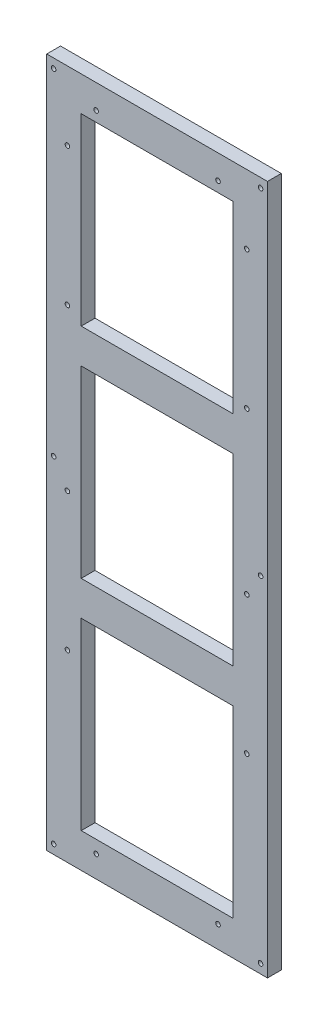
ISO-10303-21;
HEADER;
FILE_DESCRIPTION(('STEP AP214'),'2;1');
FILE_NAME('part.step','',(''),(''),'','','');
FILE_SCHEMA(('AUTOMOTIVE_DESIGN { 1 0 10303 214 1 1 1 1 }'));
ENDSEC;
DATA;
#1=APPLICATION_CONTEXT('core data for automotive mechanical design processes');
#2=APPLICATION_PROTOCOL_DEFINITION('international standard','automotive_design',2000,#1);
#3=PRODUCT_CONTEXT('',#1,'mechanical');
#4=PRODUCT('Part','Part','',(#3));
#5=PRODUCT_RELATED_PRODUCT_CATEGORY('part','',(#4));
#6=PRODUCT_DEFINITION_FORMATION('','',#4);
#7=PRODUCT_DEFINITION_CONTEXT('part definition',#1,'design');
#8=PRODUCT_DEFINITION('design','',#6,#7);
#9=PRODUCT_DEFINITION_SHAPE('','',#8);
#10=(LENGTH_UNIT() NAMED_UNIT(*) SI_UNIT(.MILLI.,.METRE.));
#11=(NAMED_UNIT(*) PLANE_ANGLE_UNIT() SI_UNIT($,.RADIAN.));
#12=(NAMED_UNIT(*) SI_UNIT($,.STERADIAN.) SOLID_ANGLE_UNIT());
#13=UNCERTAINTY_MEASURE_WITH_UNIT(LENGTH_MEASURE(1.E-05),#10,'distance_accuracy_value','');
#14=(GEOMETRIC_REPRESENTATION_CONTEXT(3) GLOBAL_UNCERTAINTY_ASSIGNED_CONTEXT((#13)) GLOBAL_UNIT_ASSIGNED_CONTEXT((#10,
#11,#12)) REPRESENTATION_CONTEXT('',''));
#15=CARTESIAN_POINT('',(0.,0.,0.));
#16=DIRECTION('',(0.,0.,1.));
#17=DIRECTION('',(1.,0.,0.));
#18=AXIS2_PLACEMENT_3D('',#15,#16,#17);
#19=CARTESIAN_POINT('',(0.,0.,6.));
#20=DIRECTION('',(0.,0.,-1.));
#21=DIRECTION('',(-1.,0.,0.));
#22=AXIS2_PLACEMENT_3D('',#19,#20,#21);
#23=PLANE('',#22);
#24=CARTESIAN_POINT('',(45.,6.00000000000001,6.));
#25=DIRECTION('',(0.,0.,1.));
#26=DIRECTION('',(1.,0.,0.));
#27=AXIS2_PLACEMENT_3D('',#24,#25,#26);
#28=CIRCLE('',#27,0.999999999999998);
#29=CARTESIAN_POINT('',(46.,6.00000000000001,6.));
#30=VERTEX_POINT('',#29);
#31=EDGE_CURVE('E724',#30,#30,#28,.T.);
#32=ORIENTED_EDGE('',*,*,#31,.F.);
#33=EDGE_LOOP('',(#32));
#34=FACE_BOUND('',#33,.T.);
#35=CARTESIAN_POINT('',(-45.,152.,6.));
#36=DIRECTION('',(0.,0.,1.));
#37=DIRECTION('',(1.,0.,0.));
#38=AXIS2_PLACEMENT_3D('',#35,#36,#37);
#39=CIRCLE('',#38,0.999999999999998);
#40=CARTESIAN_POINT('',(-44.,152.,6.));
#41=VERTEX_POINT('',#40);
#42=EDGE_CURVE('E727',#41,#41,#39,.T.);
#43=ORIENTED_EDGE('',*,*,#42,.F.);
#44=EDGE_LOOP('',(#43));
#45=FACE_BOUND('',#44,.T.);
#46=CARTESIAN_POINT('',(45.,152.,6.));
#47=DIRECTION('',(0.,0.,1.));
#48=DIRECTION('',(1.,0.,0.));
#49=AXIS2_PLACEMENT_3D('',#46,#47,#48);
#50=CIRCLE('',#49,0.999999999999998);
#51=CARTESIAN_POINT('',(46.,152.,6.));
#52=VERTEX_POINT('',#51);
#53=EDGE_CURVE('E731',#52,#52,#50,.T.);
#54=ORIENTED_EDGE('',*,*,#53,.F.);
#55=EDGE_LOOP('',(#54));
#56=FACE_BOUND('',#55,.T.);
#57=CARTESIAN_POINT('',(-45.,-140.,6.));
#58=DIRECTION('',(0.,0.,1.));
#59=DIRECTION('',(1.,0.,0.));
#60=AXIS2_PLACEMENT_3D('',#57,#58,#59);
#61=CIRCLE('',#60,0.999999999999998);
#62=CARTESIAN_POINT('',(-44.,-140.,6.));
#63=VERTEX_POINT('',#62);
#64=EDGE_CURVE('E733',#63,#63,#61,.T.);
#65=ORIENTED_EDGE('',*,*,#64,.F.);
#66=EDGE_LOOP('',(#65));
#67=FACE_BOUND('',#66,.T.);
#68=CARTESIAN_POINT('',(-45.,6.00000000000001,6.));
#69=DIRECTION('',(0.,0.,1.));
#70=DIRECTION('',(1.,0.,0.));
#71=AXIS2_PLACEMENT_3D('',#68,#69,#70);
#72=CIRCLE('',#71,0.999999999999998);
#73=CARTESIAN_POINT('',(-44.,6.00000000000001,6.));
#74=VERTEX_POINT('',#73);
#75=EDGE_CURVE('E722',#74,#74,#72,.T.);
#76=ORIENTED_EDGE('',*,*,#75,.F.);
#77=EDGE_LOOP('',(#76));
#78=FACE_BOUND('',#77,.T.);
#79=CARTESIAN_POINT('',(45.,-140.,6.));
#80=DIRECTION('',(0.,0.,1.));
#81=DIRECTION('',(1.,0.,0.));
#82=AXIS2_PLACEMENT_3D('',#79,#80,#81);
#83=CIRCLE('',#82,0.999999999999998);
#84=CARTESIAN_POINT('',(46.,-140.,6.));
#85=VERTEX_POINT('',#84);
#86=EDGE_CURVE('E319',#85,#85,#83,.T.);
#87=ORIENTED_EDGE('',*,*,#86,.F.);
#88=EDGE_LOOP('',(#87));
#89=FACE_BOUND('',#88,.T.);
#90=CARTESIAN_POINT('',(26.5,-134.5,6.));
#91=DIRECTION('',(0.,0.,1.));
#92=DIRECTION('',(1.,0.,0.));
#93=AXIS2_PLACEMENT_3D('',#90,#91,#92);
#94=CIRCLE('',#93,1.);
#95=CARTESIAN_POINT('',(27.5,-134.5,6.));
#96=VERTEX_POINT('',#95);
#97=EDGE_CURVE('E341',#96,#96,#94,.T.);
#98=ORIENTED_EDGE('',*,*,#97,.F.);
#99=EDGE_LOOP('',(#98));
#100=FACE_BOUND('',#99,.T.);
#101=CARTESIAN_POINT('',(-26.5,145.5,6.));
#102=DIRECTION('',(0.,0.,1.));
#103=DIRECTION('',(1.,0.,0.));
#104=AXIS2_PLACEMENT_3D('',#101,#102,#103);
#105=CIRCLE('',#104,1.);
#106=CARTESIAN_POINT('',(-25.5,145.5,6.));
#107=VERTEX_POINT('',#106);
#108=EDGE_CURVE('E336',#107,#107,#105,.T.);
#109=ORIENTED_EDGE('',*,*,#108,.F.);
#110=EDGE_LOOP('',(#109));
#111=FACE_BOUND('',#110,.T.);
#112=CARTESIAN_POINT('',(26.5,145.5,6.));
#113=DIRECTION('',(0.,0.,1.));
#114=DIRECTION('',(1.,0.,0.));
#115=AXIS2_PLACEMENT_3D('',#112,#113,#114);
#116=CIRCLE('',#115,1.);
#117=CARTESIAN_POINT('',(27.5,145.5,6.));
#118=VERTEX_POINT('',#117);
#119=EDGE_CURVE('E332',#118,#118,#116,.T.);
#120=ORIENTED_EDGE('',*,*,#119,.F.);
#121=EDGE_LOOP('',(#120));
#122=FACE_BOUND('',#121,.T.);
#123=CARTESIAN_POINT('',(-26.5,-134.5,6.));
#124=DIRECTION('',(0.,0.,1.));
#125=DIRECTION('',(1.,0.,0.));
#126=AXIS2_PLACEMENT_3D('',#123,#124,#125);
#127=CIRCLE('',#126,1.);
#128=CARTESIAN_POINT('',(-25.5,-134.5,6.));
#129=VERTEX_POINT('',#128);
#130=EDGE_CURVE('E305',#129,#129,#127,.T.);
#131=ORIENTED_EDGE('',*,*,#130,.F.);
#132=EDGE_LOOP('',(#131));
#133=FACE_BOUND('',#132,.T.);
#134=CARTESIAN_POINT('',(39.,66.,6.));
#135=DIRECTION('',(0.,0.,1.));
#136=DIRECTION('',(-1.,0.,0.));
#137=AXIS2_PLACEMENT_3D('',#134,#135,#136);
#138=CIRCLE('',#137,0.999999999999998);
#139=CARTESIAN_POINT('',(38.,66.,6.));
#140=VERTEX_POINT('',#139);
#141=EDGE_CURVE('E356',#140,#140,#138,.T.);
#142=ORIENTED_EDGE('',*,*,#141,.F.);
#143=EDGE_LOOP('',(#142));
#144=FACE_BOUND('',#143,.T.);
#145=CARTESIAN_POINT('',(-39.,-3.99999999999998,6.));
#146=DIRECTION('',(0.,0.,1.));
#147=DIRECTION('',(1.,0.,0.));
#148=AXIS2_PLACEMENT_3D('',#145,#146,#147);
#149=CIRCLE('',#148,0.999999999999998);
#150=CARTESIAN_POINT('',(-38.,-3.99999999999998,6.));
#151=VERTEX_POINT('',#150);
#152=EDGE_CURVE('E359',#151,#151,#149,.T.);
#153=ORIENTED_EDGE('',*,*,#152,.F.);
#154=EDGE_LOOP('',(#153));
#155=FACE_BOUND('',#154,.T.);
#156=CARTESIAN_POINT('',(39.,-3.99999999999998,6.));
#157=DIRECTION('',(0.,0.,1.));
#158=DIRECTION('',(-1.,0.,0.));
#159=AXIS2_PLACEMENT_3D('',#156,#157,#158);
#160=CIRCLE('',#159,0.999999999999998);
#161=CARTESIAN_POINT('',(38.,-3.99999999999998,6.));
#162=VERTEX_POINT('',#161);
#163=EDGE_CURVE('E362',#162,#162,#160,.T.);
#164=ORIENTED_EDGE('',*,*,#163,.F.);
#165=EDGE_LOOP('',(#164));
#166=FACE_BOUND('',#165,.T.);
#167=CARTESIAN_POINT('',(39.,-64.,6.));
#168=DIRECTION('',(0.,0.,1.));
#169=DIRECTION('',(-1.,0.,0.));
#170=AXIS2_PLACEMENT_3D('',#167,#168,#169);
#171=CIRCLE('',#170,0.999999999999998);
#172=CARTESIAN_POINT('',(38.,-64.,6.));
#173=VERTEX_POINT('',#172);
#174=EDGE_CURVE('E365',#173,#173,#171,.T.);
#175=ORIENTED_EDGE('',*,*,#174,.F.);
#176=EDGE_LOOP('',(#175));
#177=FACE_BOUND('',#176,.T.);
#178=CARTESIAN_POINT('',(-39.,66.,6.));
#179=DIRECTION('',(0.,0.,1.));
#180=DIRECTION('',(1.,0.,0.));
#181=AXIS2_PLACEMENT_3D('',#178,#179,#180);
#182=CIRCLE('',#181,0.999999999999998);
#183=CARTESIAN_POINT('',(-38.,66.,6.));
#184=VERTEX_POINT('',#183);
#185=EDGE_CURVE('E314',#184,#184,#182,.T.);
#186=ORIENTED_EDGE('',*,*,#185,.F.);
#187=EDGE_LOOP('',(#186));
#188=FACE_BOUND('',#187,.T.);
#189=CARTESIAN_POINT('',(-39.,-64.,6.));
#190=DIRECTION('',(0.,0.,1.));
#191=DIRECTION('',(1.,0.,0.));
#192=AXIS2_PLACEMENT_3D('',#189,#190,#191);
#193=CIRCLE('',#192,0.999999999999998);
#194=CARTESIAN_POINT('',(-38.,-64.,6.));
#195=VERTEX_POINT('',#194);
#196=EDGE_CURVE('E352',#195,#195,#193,.T.);
#197=ORIENTED_EDGE('',*,*,#196,.F.);
#198=EDGE_LOOP('',(#197));
#199=FACE_BOUND('',#198,.T.);
#200=CARTESIAN_POINT('',(39.,126.,6.));
#201=DIRECTION('',(0.,0.,1.));
#202=DIRECTION('',(-1.,0.,0.));
#203=AXIS2_PLACEMENT_3D('',#200,#201,#202);
#204=CIRCLE('',#203,0.999999999999998);
#205=CARTESIAN_POINT('',(38.,126.,6.));
#206=VERTEX_POINT('',#205);
#207=EDGE_CURVE('E353',#206,#206,#204,.T.);
#208=ORIENTED_EDGE('',*,*,#207,.F.);
#209=EDGE_LOOP('',(#208));
#210=FACE_BOUND('',#209,.T.);
#211=CARTESIAN_POINT('',(-39.,126.,6.));
#212=DIRECTION('',(0.,0.,1.));
#213=DIRECTION('',(1.,0.,0.));
#214=AXIS2_PLACEMENT_3D('',#211,#212,#213);
#215=CIRCLE('',#214,0.999999999999998);
#216=CARTESIAN_POINT('',(-38.,126.,6.));
#217=VERTEX_POINT('',#216);
#218=EDGE_CURVE('E281',#217,#217,#215,.T.);
#219=ORIENTED_EDGE('',*,*,#218,.F.);
#220=EDGE_LOOP('',(#219));
#221=FACE_BOUND('',#220,.T.);
#222=DIRECTION('',(0.,-1.,0.));
#223=VECTOR('',#222,1.);
#224=CARTESIAN_POINT('',(-33.,-49.,6.));
#225=LINE('',#224,#223);
#226=CARTESIAN_POINT('',(-33.,-49.,6.));
#227=VERTEX_POINT('',#226);
#228=CARTESIAN_POINT('',(-33.,-129.,6.));
#229=VERTEX_POINT('',#228);
#230=EDGE_CURVE('E190',#227,#229,#225,.T.);
#231=ORIENTED_EDGE('',*,*,#230,.F.);
#232=DIRECTION('',(-1.,0.,0.));
#233=VECTOR('',#232,1.);
#234=CARTESIAN_POINT('',(-33.,-49.,6.));
#235=LINE('',#234,#233);
#236=CARTESIAN_POINT('',(33.,-49.,6.));
#237=VERTEX_POINT('',#236);
#238=EDGE_CURVE('E198',#237,#227,#235,.T.);
#239=ORIENTED_EDGE('',*,*,#238,.F.);
#240=DIRECTION('',(0.,1.,0.));
#241=VECTOR('',#240,1.);
#242=CARTESIAN_POINT('',(33.,-49.,6.));
#243=LINE('',#242,#241);
#244=CARTESIAN_POINT('',(33.,-129.,6.));
#245=VERTEX_POINT('',#244);
#246=EDGE_CURVE('E195',#245,#237,#243,.T.);
#247=ORIENTED_EDGE('',*,*,#246,.F.);
#248=DIRECTION('',(1.,0.,0.));
#249=VECTOR('',#248,1.);
#250=CARTESIAN_POINT('',(-33.,-129.,6.));
#251=LINE('',#250,#249);
#252=EDGE_CURVE('E192',#229,#245,#251,.T.);
#253=ORIENTED_EDGE('',*,*,#252,.F.);
#254=EDGE_LOOP('',(#231,#239,#247,#253));
#255=FACE_BOUND('',#254,.T.);
#256=DIRECTION('',(0.,1.,0.));
#257=VECTOR('',#256,1.);
#258=CARTESIAN_POINT('',(48.,-144.,6.));
#259=LINE('',#258,#257);
#260=CARTESIAN_POINT('',(48.,-144.,6.));
#261=VERTEX_POINT('',#260);
#262=CARTESIAN_POINT('',(48.,156.,6.));
#263=VERTEX_POINT('',#262);
#264=EDGE_CURVE('E252',#261,#263,#259,.T.);
#265=ORIENTED_EDGE('',*,*,#264,.T.);
#266=DIRECTION('',(-1.,0.,0.));
#267=VECTOR('',#266,1.);
#268=CARTESIAN_POINT('',(-48.,156.,6.));
#269=LINE('',#268,#267);
#270=CARTESIAN_POINT('',(-48.,156.,6.));
#271=VERTEX_POINT('',#270);
#272=EDGE_CURVE('E255',#263,#271,#269,.T.);
#273=ORIENTED_EDGE('',*,*,#272,.T.);
#274=DIRECTION('',(0.,-1.,0.));
#275=VECTOR('',#274,1.);
#276=CARTESIAN_POINT('',(-48.,-144.,6.));
#277=LINE('',#276,#275);
#278=CARTESIAN_POINT('',(-48.,-144.,6.));
#279=VERTEX_POINT('',#278);
#280=EDGE_CURVE('E258',#271,#279,#277,.T.);
#281=ORIENTED_EDGE('',*,*,#280,.T.);
#282=DIRECTION('',(1.,0.,0.));
#283=VECTOR('',#282,1.);
#284=CARTESIAN_POINT('',(-48.,-144.,6.));
#285=LINE('',#284,#283);
#286=EDGE_CURVE('E260',#279,#261,#285,.T.);
#287=ORIENTED_EDGE('',*,*,#286,.T.);
#288=EDGE_LOOP('',(#265,#273,#281,#287));
#289=FACE_BOUND('',#288,.T.);
#290=DIRECTION('',(-1.,0.,0.));
#291=VECTOR('',#290,1.);
#292=CARTESIAN_POINT('',(-33.,141.,6.));
#293=LINE('',#292,#291);
#294=CARTESIAN_POINT('',(33.,141.,6.));
#295=VERTEX_POINT('',#294);
#296=CARTESIAN_POINT('',(-33.,141.,6.));
#297=VERTEX_POINT('',#296);
#298=EDGE_CURVE('E221',#295,#297,#293,.T.);
#299=ORIENTED_EDGE('',*,*,#298,.F.);
#300=DIRECTION('',(0.,1.,0.));
#301=VECTOR('',#300,1.);
#302=CARTESIAN_POINT('',(33.,141.,6.));
#303=LINE('',#302,#301);
#304=CARTESIAN_POINT('',(33.,61.,6.));
#305=VERTEX_POINT('',#304);
#306=EDGE_CURVE('E229',#305,#295,#303,.T.);
#307=ORIENTED_EDGE('',*,*,#306,.F.);
#308=DIRECTION('',(1.,0.,0.));
#309=VECTOR('',#308,1.);
#310=CARTESIAN_POINT('',(-33.,61.,6.));
#311=LINE('',#310,#309);
#312=CARTESIAN_POINT('',(-33.,61.,6.));
#313=VERTEX_POINT('',#312);
#314=EDGE_CURVE('E226',#313,#305,#311,.T.);
#315=ORIENTED_EDGE('',*,*,#314,.F.);
#316=DIRECTION('',(0.,-1.,0.));
#317=VECTOR('',#316,1.);
#318=CARTESIAN_POINT('',(-33.,61.,6.));
#319=LINE('',#318,#317);
#320=EDGE_CURVE('E223',#297,#313,#319,.T.);
#321=ORIENTED_EDGE('',*,*,#320,.F.);
#322=EDGE_LOOP('',(#299,#307,#315,#321));
#323=FACE_BOUND('',#322,.T.);
#324=DIRECTION('',(0.,1.,0.));
#325=VECTOR('',#324,1.);
#326=CARTESIAN_POINT('',(33.,46.,6.));
#327=LINE('',#326,#325);
#328=CARTESIAN_POINT('',(33.,-34.,6.));
#329=VERTEX_POINT('',#328);
#330=CARTESIAN_POINT('',(33.,46.,6.));
#331=VERTEX_POINT('',#330);
#332=EDGE_CURVE('E152',#329,#331,#327,.T.);
#333=ORIENTED_EDGE('',*,*,#332,.F.);
#334=DIRECTION('',(1.,0.,0.));
#335=VECTOR('',#334,1.);
#336=CARTESIAN_POINT('',(-33.,-34.,6.));
#337=LINE('',#336,#335);
#338=CARTESIAN_POINT('',(-33.,-34.,6.));
#339=VERTEX_POINT('',#338);
#340=EDGE_CURVE('E174',#339,#329,#337,.T.);
#341=ORIENTED_EDGE('',*,*,#340,.F.);
#342=DIRECTION('',(0.,-1.,0.));
#343=VECTOR('',#342,1.);
#344=CARTESIAN_POINT('',(-33.,46.,6.));
#345=LINE('',#344,#343);
#346=CARTESIAN_POINT('',(-33.,46.,6.));
#347=VERTEX_POINT('',#346);
#348=EDGE_CURVE('E172',#347,#339,#345,.T.);
#349=ORIENTED_EDGE('',*,*,#348,.F.);
#350=DIRECTION('',(-1.,0.,0.));
#351=VECTOR('',#350,1.);
#352=CARTESIAN_POINT('',(-33.,46.,6.));
#353=LINE('',#352,#351);
#354=EDGE_CURVE('E160',#331,#347,#353,.T.);
#355=ORIENTED_EDGE('',*,*,#354,.F.);
#356=EDGE_LOOP('',(#333,#341,#349,#355));
#357=FACE_BOUND('',#356,.T.);
#358=ADVANCED_FACE('F37',(#34,#45,#56,#67,#78,#89,#100,#111,#122,#133,#144,#155,#166,#177,#188,
#199,#210,#221,#255,#289,#323,#357),#23,.F.);
#359=CARTESIAN_POINT('',(0.,0.,0.));
#360=DIRECTION('',(0.,0.,-1.));
#361=DIRECTION('',(-1.,0.,0.));
#362=AXIS2_PLACEMENT_3D('',#359,#360,#361);
#363=PLANE('',#362);
#364=CARTESIAN_POINT('',(45.,6.00000000000001,0.));
#365=DIRECTION('',(0.,0.,-1.));
#366=DIRECTION('',(-1.,0.,0.));
#367=AXIS2_PLACEMENT_3D('',#364,#365,#366);
#368=CIRCLE('',#367,0.999999999999998);
#369=CARTESIAN_POINT('',(44.,6.00000000000001,0.));
#370=VERTEX_POINT('',#369);
#371=EDGE_CURVE('E41',#370,#370,#368,.T.);
#372=ORIENTED_EDGE('',*,*,#371,.F.);
#373=EDGE_LOOP('',(#372));
#374=FACE_BOUND('',#373,.T.);
#375=CARTESIAN_POINT('',(-45.,152.,0.));
#376=DIRECTION('',(0.,0.,-1.));
#377=DIRECTION('',(-1.,0.,0.));
#378=AXIS2_PLACEMENT_3D('',#375,#376,#377);
#379=CIRCLE('',#378,0.999999999999998);
#380=CARTESIAN_POINT('',(-46.,152.,0.));
#381=VERTEX_POINT('',#380);
#382=EDGE_CURVE('E327',#381,#381,#379,.T.);
#383=ORIENTED_EDGE('',*,*,#382,.F.);
#384=EDGE_LOOP('',(#383));
#385=FACE_BOUND('',#384,.T.);
#386=CARTESIAN_POINT('',(45.,152.,0.));
#387=DIRECTION('',(0.,0.,-1.));
#388=DIRECTION('',(-1.,0.,0.));
#389=AXIS2_PLACEMENT_3D('',#386,#387,#388);
#390=CIRCLE('',#389,0.999999999999998);
#391=CARTESIAN_POINT('',(44.,152.,0.));
#392=VERTEX_POINT('',#391);
#393=EDGE_CURVE('E325',#392,#392,#390,.T.);
#394=ORIENTED_EDGE('',*,*,#393,.F.);
#395=EDGE_LOOP('',(#394));
#396=FACE_BOUND('',#395,.T.);
#397=CARTESIAN_POINT('',(-45.,-140.,0.));
#398=DIRECTION('',(0.,0.,-1.));
#399=DIRECTION('',(-1.,0.,0.));
#400=AXIS2_PLACEMENT_3D('',#397,#398,#399);
#401=CIRCLE('',#400,0.999999999999998);
#402=CARTESIAN_POINT('',(-46.,-140.,0.));
#403=VERTEX_POINT('',#402);
#404=EDGE_CURVE('E322',#403,#403,#401,.T.);
#405=ORIENTED_EDGE('',*,*,#404,.F.);
#406=EDGE_LOOP('',(#405));
#407=FACE_BOUND('',#406,.T.);
#408=CARTESIAN_POINT('',(-45.,6.00000000000001,0.));
#409=DIRECTION('',(0.,0.,-1.));
#410=DIRECTION('',(-1.,0.,0.));
#411=AXIS2_PLACEMENT_3D('',#408,#409,#410);
#412=CIRCLE('',#411,0.999999999999998);
#413=CARTESIAN_POINT('',(-46.,6.00000000000001,0.));
#414=VERTEX_POINT('',#413);
#415=EDGE_CURVE('E318',#414,#414,#412,.T.);
#416=ORIENTED_EDGE('',*,*,#415,.F.);
#417=EDGE_LOOP('',(#416));
#418=FACE_BOUND('',#417,.T.);
#419=CARTESIAN_POINT('',(45.,-140.,0.));
#420=DIRECTION('',(0.,0.,-1.));
#421=DIRECTION('',(-1.,0.,0.));
#422=AXIS2_PLACEMENT_3D('',#419,#420,#421);
#423=CIRCLE('',#422,0.999999999999998);
#424=CARTESIAN_POINT('',(44.,-140.,0.));
#425=VERTEX_POINT('',#424);
#426=EDGE_CURVE('E315',#425,#425,#423,.T.);
#427=ORIENTED_EDGE('',*,*,#426,.F.);
#428=EDGE_LOOP('',(#427));
#429=FACE_BOUND('',#428,.T.);
#430=CARTESIAN_POINT('',(26.5,-134.5,0.));
#431=DIRECTION('',(0.,0.,-1.));
#432=DIRECTION('',(-1.,0.,0.));
#433=AXIS2_PLACEMENT_3D('',#430,#431,#432);
#434=CIRCLE('',#433,1.);
#435=CARTESIAN_POINT('',(25.5,-134.5,0.));
#436=VERTEX_POINT('',#435);
#437=EDGE_CURVE('E311',#436,#436,#434,.T.);
#438=ORIENTED_EDGE('',*,*,#437,.F.);
#439=EDGE_LOOP('',(#438));
#440=FACE_BOUND('',#439,.T.);
#441=CARTESIAN_POINT('',(-26.5,145.5,0.));
#442=DIRECTION('',(0.,0.,-1.));
#443=DIRECTION('',(-1.,0.,0.));
#444=AXIS2_PLACEMENT_3D('',#441,#442,#443);
#445=CIRCLE('',#444,1.);
#446=CARTESIAN_POINT('',(-27.5,145.5,0.));
#447=VERTEX_POINT('',#446);
#448=EDGE_CURVE('E308',#447,#447,#445,.T.);
#449=ORIENTED_EDGE('',*,*,#448,.F.);
#450=EDGE_LOOP('',(#449));
#451=FACE_BOUND('',#450,.T.);
#452=CARTESIAN_POINT('',(26.5,145.5,0.));
#453=DIRECTION('',(0.,0.,-1.));
#454=DIRECTION('',(-1.,0.,0.));
#455=AXIS2_PLACEMENT_3D('',#452,#453,#454);
#456=CIRCLE('',#455,1.);
#457=CARTESIAN_POINT('',(25.5,145.5,0.));
#458=VERTEX_POINT('',#457);
#459=EDGE_CURVE('E304',#458,#458,#456,.T.);
#460=ORIENTED_EDGE('',*,*,#459,.F.);
#461=EDGE_LOOP('',(#460));
#462=FACE_BOUND('',#461,.T.);
#463=CARTESIAN_POINT('',(-26.5,-134.5,0.));
#464=DIRECTION('',(0.,0.,-1.));
#465=DIRECTION('',(-1.,0.,0.));
#466=AXIS2_PLACEMENT_3D('',#463,#464,#465);
#467=CIRCLE('',#466,1.);
#468=CARTESIAN_POINT('',(-27.5,-134.5,0.));
#469=VERTEX_POINT('',#468);
#470=EDGE_CURVE('E301',#469,#469,#467,.T.);
#471=ORIENTED_EDGE('',*,*,#470,.F.);
#472=EDGE_LOOP('',(#471));
#473=FACE_BOUND('',#472,.T.);
#474=CARTESIAN_POINT('',(39.,66.,0.));
#475=DIRECTION('',(0.,0.,-1.));
#476=DIRECTION('',(-1.,0.,0.));
#477=AXIS2_PLACEMENT_3D('',#474,#475,#476);
#478=CIRCLE('',#477,0.999999999999998);
#479=CARTESIAN_POINT('',(38.,66.,0.));
#480=VERTEX_POINT('',#479);
#481=EDGE_CURVE('E180',#480,#480,#478,.T.);
#482=ORIENTED_EDGE('',*,*,#481,.F.);
#483=EDGE_LOOP('',(#482));
#484=FACE_BOUND('',#483,.T.);
#485=CARTESIAN_POINT('',(-39.,-3.99999999999998,0.));
#486=DIRECTION('',(0.,0.,-1.));
#487=DIRECTION('',(-1.,0.,0.));
#488=AXIS2_PLACEMENT_3D('',#485,#486,#487);
#489=CIRCLE('',#488,0.999999999999998);
#490=CARTESIAN_POINT('',(-40.,-3.99999999999998,0.));
#491=VERTEX_POINT('',#490);
#492=EDGE_CURVE('E296',#491,#491,#489,.T.);
#493=ORIENTED_EDGE('',*,*,#492,.F.);
#494=EDGE_LOOP('',(#493));
#495=FACE_BOUND('',#494,.T.);
#496=CARTESIAN_POINT('',(39.,-3.99999999999998,0.));
#497=DIRECTION('',(0.,0.,-1.));
#498=DIRECTION('',(-1.,0.,0.));
#499=AXIS2_PLACEMENT_3D('',#496,#497,#498);
#500=CIRCLE('',#499,0.999999999999998);
#501=CARTESIAN_POINT('',(38.,-3.99999999999998,0.));
#502=VERTEX_POINT('',#501);
#503=EDGE_CURVE('E293',#502,#502,#500,.T.);
#504=ORIENTED_EDGE('',*,*,#503,.F.);
#505=EDGE_LOOP('',(#504));
#506=FACE_BOUND('',#505,.T.);
#507=CARTESIAN_POINT('',(39.,-64.,0.));
#508=DIRECTION('',(0.,0.,-1.));
#509=DIRECTION('',(-1.,0.,0.));
#510=AXIS2_PLACEMENT_3D('',#507,#508,#509);
#511=CIRCLE('',#510,0.999999999999998);
#512=CARTESIAN_POINT('',(38.,-64.,0.));
#513=VERTEX_POINT('',#512);
#514=EDGE_CURVE('E290',#513,#513,#511,.T.);
#515=ORIENTED_EDGE('',*,*,#514,.F.);
#516=EDGE_LOOP('',(#515));
#517=FACE_BOUND('',#516,.T.);
#518=CARTESIAN_POINT('',(-39.,66.,0.));
#519=DIRECTION('',(0.,0.,-1.));
#520=DIRECTION('',(-1.,0.,0.));
#521=AXIS2_PLACEMENT_3D('',#518,#519,#520);
#522=CIRCLE('',#521,0.999999999999998);
#523=CARTESIAN_POINT('',(-40.,66.,0.));
#524=VERTEX_POINT('',#523);
#525=EDGE_CURVE('E287',#524,#524,#522,.T.);
#526=ORIENTED_EDGE('',*,*,#525,.F.);
#527=EDGE_LOOP('',(#526));
#528=FACE_BOUND('',#527,.T.);
#529=CARTESIAN_POINT('',(-39.,-64.,0.));
#530=DIRECTION('',(0.,0.,-1.));
#531=DIRECTION('',(-1.,0.,0.));
#532=AXIS2_PLACEMENT_3D('',#529,#530,#531);
#533=CIRCLE('',#532,0.999999999999998);
#534=CARTESIAN_POINT('',(-40.,-64.,0.));
#535=VERTEX_POINT('',#534);
#536=EDGE_CURVE('E284',#535,#535,#533,.T.);
#537=ORIENTED_EDGE('',*,*,#536,.F.);
#538=EDGE_LOOP('',(#537));
#539=FACE_BOUND('',#538,.T.);
#540=CARTESIAN_POINT('',(39.,126.,0.));
#541=DIRECTION('',(0.,0.,-1.));
#542=DIRECTION('',(-1.,0.,0.));
#543=AXIS2_PLACEMENT_3D('',#540,#541,#542);
#544=CIRCLE('',#543,0.999999999999998);
#545=CARTESIAN_POINT('',(38.,126.,0.));
#546=VERTEX_POINT('',#545);
#547=EDGE_CURVE('E280',#546,#546,#544,.T.);
#548=ORIENTED_EDGE('',*,*,#547,.F.);
#549=EDGE_LOOP('',(#548));
#550=FACE_BOUND('',#549,.T.);
#551=CARTESIAN_POINT('',(-39.,126.,0.));
#552=DIRECTION('',(0.,0.,-1.));
#553=DIRECTION('',(-1.,0.,0.));
#554=AXIS2_PLACEMENT_3D('',#551,#552,#553);
#555=CIRCLE('',#554,0.999999999999998);
#556=CARTESIAN_POINT('',(-40.,126.,0.));
#557=VERTEX_POINT('',#556);
#558=EDGE_CURVE('E277',#557,#557,#555,.T.);
#559=ORIENTED_EDGE('',*,*,#558,.F.);
#560=EDGE_LOOP('',(#559));
#561=FACE_BOUND('',#560,.T.);
#562=DIRECTION('',(0.,1.,0.));
#563=VECTOR('',#562,1.);
#564=CARTESIAN_POINT('',(48.,-144.,0.));
#565=LINE('',#564,#563);
#566=CARTESIAN_POINT('',(48.,-144.,0.));
#567=VERTEX_POINT('',#566);
#568=CARTESIAN_POINT('',(48.,156.,0.));
#569=VERTEX_POINT('',#568);
#570=EDGE_CURVE('E251',#567,#569,#565,.T.);
#571=ORIENTED_EDGE('',*,*,#570,.F.);
#572=DIRECTION('',(1.,0.,0.));
#573=VECTOR('',#572,1.);
#574=CARTESIAN_POINT('',(-48.,-144.,0.));
#575=LINE('',#574,#573);
#576=CARTESIAN_POINT('',(-48.,-144.,0.));
#577=VERTEX_POINT('',#576);
#578=EDGE_CURVE('E256',#577,#567,#575,.T.);
#579=ORIENTED_EDGE('',*,*,#578,.F.);
#580=DIRECTION('',(0.,-1.,0.));
#581=VECTOR('',#580,1.);
#582=CARTESIAN_POINT('',(-48.,-144.,0.));
#583=LINE('',#582,#581);
#584=CARTESIAN_POINT('',(-48.,156.,0.));
#585=VERTEX_POINT('',#584);
#586=EDGE_CURVE('E267',#585,#577,#583,.T.);
#587=ORIENTED_EDGE('',*,*,#586,.F.);
#588=DIRECTION('',(-1.,0.,0.));
#589=VECTOR('',#588,1.);
#590=CARTESIAN_POINT('',(-48.,156.,0.));
#591=LINE('',#590,#589);
#592=EDGE_CURVE('E265',#569,#585,#591,.T.);
#593=ORIENTED_EDGE('',*,*,#592,.F.);
#594=EDGE_LOOP('',(#571,#579,#587,#593));
#595=FACE_BOUND('',#594,.T.);
#596=DIRECTION('',(0.,1.,0.));
#597=VECTOR('',#596,1.);
#598=CARTESIAN_POINT('',(33.,141.,0.));
#599=LINE('',#598,#597);
#600=CARTESIAN_POINT('',(33.,61.,0.));
#601=VERTEX_POINT('',#600);
#602=CARTESIAN_POINT('',(33.,141.,0.));
#603=VERTEX_POINT('',#602);
#604=EDGE_CURVE('E224',#601,#603,#599,.T.);
#605=ORIENTED_EDGE('',*,*,#604,.T.);
#606=DIRECTION('',(-1.,0.,0.));
#607=VECTOR('',#606,1.);
#608=CARTESIAN_POINT('',(-33.,141.,0.));
#609=LINE('',#608,#607);
#610=CARTESIAN_POINT('',(-33.,141.,0.));
#611=VERTEX_POINT('',#610);
#612=EDGE_CURVE('E220',#603,#611,#609,.T.);
#613=ORIENTED_EDGE('',*,*,#612,.T.);
#614=DIRECTION('',(0.,-1.,0.));
#615=VECTOR('',#614,1.);
#616=CARTESIAN_POINT('',(-33.,61.,0.));
#617=LINE('',#616,#615);
#618=CARTESIAN_POINT('',(-33.,61.,0.));
#619=VERTEX_POINT('',#618);
#620=EDGE_CURVE('E234',#611,#619,#617,.T.);
#621=ORIENTED_EDGE('',*,*,#620,.T.);
#622=DIRECTION('',(1.,0.,0.));
#623=VECTOR('',#622,1.);
#624=CARTESIAN_POINT('',(-33.,61.,0.));
#625=LINE('',#624,#623);
#626=EDGE_CURVE('E237',#619,#601,#625,.T.);
#627=ORIENTED_EDGE('',*,*,#626,.T.);
#628=EDGE_LOOP('',(#605,#613,#621,#627));
#629=FACE_BOUND('',#628,.T.);
#630=DIRECTION('',(-1.,0.,0.));
#631=VECTOR('',#630,1.);
#632=CARTESIAN_POINT('',(-33.,-49.,0.));
#633=LINE('',#632,#631);
#634=CARTESIAN_POINT('',(33.,-49.,0.));
#635=VERTEX_POINT('',#634);
#636=CARTESIAN_POINT('',(-33.,-49.,0.));
#637=VERTEX_POINT('',#636);
#638=EDGE_CURVE('E193',#635,#637,#633,.T.);
#639=ORIENTED_EDGE('',*,*,#638,.T.);
#640=DIRECTION('',(0.,-1.,0.));
#641=VECTOR('',#640,1.);
#642=CARTESIAN_POINT('',(-33.,-49.,0.));
#643=LINE('',#642,#641);
#644=CARTESIAN_POINT('',(-33.,-129.,0.));
#645=VERTEX_POINT('',#644);
#646=EDGE_CURVE('E168',#637,#645,#643,.T.);
#647=ORIENTED_EDGE('',*,*,#646,.T.);
#648=DIRECTION('',(1.,0.,0.));
#649=VECTOR('',#648,1.);
#650=CARTESIAN_POINT('',(-33.,-129.,0.));
#651=LINE('',#650,#649);
#652=CARTESIAN_POINT('',(33.,-129.,0.));
#653=VERTEX_POINT('',#652);
#654=EDGE_CURVE('E203',#645,#653,#651,.T.);
#655=ORIENTED_EDGE('',*,*,#654,.T.);
#656=DIRECTION('',(0.,1.,0.));
#657=VECTOR('',#656,1.);
#658=CARTESIAN_POINT('',(33.,-49.,0.));
#659=LINE('',#658,#657);
#660=EDGE_CURVE('E206',#653,#635,#659,.T.);
#661=ORIENTED_EDGE('',*,*,#660,.T.);
#662=EDGE_LOOP('',(#639,#647,#655,#661));
#663=FACE_BOUND('',#662,.T.);
#664=DIRECTION('',(1.,0.,0.));
#665=VECTOR('',#664,1.);
#666=CARTESIAN_POINT('',(-33.,-34.,0.));
#667=LINE('',#666,#665);
#668=CARTESIAN_POINT('',(-33.,-34.,0.));
#669=VERTEX_POINT('',#668);
#670=CARTESIAN_POINT('',(33.,-34.,0.));
#671=VERTEX_POINT('',#670);
#672=EDGE_CURVE('E161',#669,#671,#667,.T.);
#673=ORIENTED_EDGE('',*,*,#672,.T.);
#674=DIRECTION('',(0.,1.,0.));
#675=VECTOR('',#674,1.);
#676=CARTESIAN_POINT('',(33.,46.,0.));
#677=LINE('',#676,#675);
#678=CARTESIAN_POINT('',(33.,46.,0.));
#679=VERTEX_POINT('',#678);
#680=EDGE_CURVE('E62',#671,#679,#677,.T.);
#681=ORIENTED_EDGE('',*,*,#680,.T.);
#682=DIRECTION('',(-1.,0.,0.));
#683=VECTOR('',#682,1.);
#684=CARTESIAN_POINT('',(-33.,46.,0.));
#685=LINE('',#684,#683);
#686=CARTESIAN_POINT('',(-33.,46.,0.));
#687=VERTEX_POINT('',#686);
#688=EDGE_CURVE('E167',#679,#687,#685,.T.);
#689=ORIENTED_EDGE('',*,*,#688,.T.);
#690=DIRECTION('',(0.,-1.,0.));
#691=VECTOR('',#690,1.);
#692=CARTESIAN_POINT('',(-33.,46.,0.));
#693=LINE('',#692,#691);
#694=EDGE_CURVE('E182',#687,#669,#693,.T.);
#695=ORIENTED_EDGE('',*,*,#694,.T.);
#696=EDGE_LOOP('',(#673,#681,#689,#695));
#697=FACE_BOUND('',#696,.T.);
#698=ADVANCED_FACE('F376',(#374,#385,#396,#407,#418,#429,#440,#451,#462,#473,#484,#495,#506,
#517,#528,#539,#550,#561,#595,#629,#663,#697),#363,.T.);
#699=CARTESIAN_POINT('',(48.,-144.,6.));
#700=DIRECTION('',(-1.,0.,0.));
#701=DIRECTION('',(0.,-1.,0.));
#702=AXIS2_PLACEMENT_3D('',#699,#700,#701);
#703=PLANE('',#702);
#704=ORIENTED_EDGE('',*,*,#570,.T.);
#705=DIRECTION('',(0.,0.,-1.));
#706=VECTOR('',#705,1.);
#707=CARTESIAN_POINT('',(48.,156.,6.));
#708=LINE('',#707,#706);
#709=EDGE_CURVE('E11',#263,#569,#708,.T.);
#710=ORIENTED_EDGE('',*,*,#709,.F.);
#711=ORIENTED_EDGE('',*,*,#264,.F.);
#712=DIRECTION('',(0.,0.,-1.));
#713=VECTOR('',#712,1.);
#714=CARTESIAN_POINT('',(48.,-144.,6.));
#715=LINE('',#714,#713);
#716=EDGE_CURVE('E262',#261,#567,#715,.T.);
#717=ORIENTED_EDGE('',*,*,#716,.T.);
#718=EDGE_LOOP('',(#704,#710,#711,#717));
#719=FACE_BOUND('',#718,.T.);
#720=ADVANCED_FACE('F39',(#719),#703,.F.);
#721=CARTESIAN_POINT('',(-48.,156.,6.));
#722=DIRECTION('',(0.,-1.,0.));
#723=DIRECTION('',(0.,0.,-1.));
#724=AXIS2_PLACEMENT_3D('',#721,#722,#723);
#725=PLANE('',#724);
#726=ORIENTED_EDGE('',*,*,#592,.T.);
#727=DIRECTION('',(0.,0.,-1.));
#728=VECTOR('',#727,1.);
#729=CARTESIAN_POINT('',(-48.,156.,6.));
#730=LINE('',#729,#728);
#731=EDGE_CURVE('E46',#271,#585,#730,.T.);
#732=ORIENTED_EDGE('',*,*,#731,.F.);
#733=ORIENTED_EDGE('',*,*,#272,.F.);
#734=ORIENTED_EDGE('',*,*,#709,.T.);
#735=EDGE_LOOP('',(#726,#732,#733,#734));
#736=FACE_BOUND('',#735,.T.);
#737=ADVANCED_FACE('F427',(#736),#725,.F.);
#738=CARTESIAN_POINT('',(-48.,-144.,6.));
#739=DIRECTION('',(1.,0.,0.));
#740=DIRECTION('',(0.,1.,0.));
#741=AXIS2_PLACEMENT_3D('',#738,#739,#740);
#742=PLANE('',#741);
#743=ORIENTED_EDGE('',*,*,#586,.T.);
#744=DIRECTION('',(0.,0.,-1.));
#745=VECTOR('',#744,1.);
#746=CARTESIAN_POINT('',(-48.,-144.,6.));
#747=LINE('',#746,#745);
#748=EDGE_CURVE('E272',#279,#577,#747,.T.);
#749=ORIENTED_EDGE('',*,*,#748,.F.);
#750=ORIENTED_EDGE('',*,*,#280,.F.);
#751=ORIENTED_EDGE('',*,*,#731,.T.);
#752=EDGE_LOOP('',(#743,#749,#750,#751));
#753=FACE_BOUND('',#752,.T.);
#754=ADVANCED_FACE('F424',(#753),#742,.F.);
#755=CARTESIAN_POINT('',(-48.,-144.,6.));
#756=DIRECTION('',(0.,1.,0.));
#757=DIRECTION('',(0.,0.,1.));
#758=AXIS2_PLACEMENT_3D('',#755,#756,#757);
#759=PLANE('',#758);
#760=ORIENTED_EDGE('',*,*,#578,.T.);
#761=ORIENTED_EDGE('',*,*,#716,.F.);
#762=ORIENTED_EDGE('',*,*,#286,.F.);
#763=ORIENTED_EDGE('',*,*,#748,.T.);
#764=EDGE_LOOP('',(#760,#761,#762,#763));
#765=FACE_BOUND('',#764,.T.);
#766=ADVANCED_FACE('F417',(#765),#759,.F.);
#767=CARTESIAN_POINT('',(-33.,141.,6.));
#768=DIRECTION('',(0.,-1.,0.));
#769=DIRECTION('',(0.,0.,-1.));
#770=AXIS2_PLACEMENT_3D('',#767,#768,#769);
#771=PLANE('',#770);
#772=ORIENTED_EDGE('',*,*,#612,.F.);
#773=DIRECTION('',(0.,0.,-1.));
#774=VECTOR('',#773,1.);
#775=CARTESIAN_POINT('',(33.,141.,6.));
#776=LINE('',#775,#774);
#777=EDGE_CURVE('E231',#295,#603,#776,.T.);
#778=ORIENTED_EDGE('',*,*,#777,.F.);
#779=ORIENTED_EDGE('',*,*,#298,.T.);
#780=DIRECTION('',(0.,0.,-1.));
#781=VECTOR('',#780,1.);
#782=CARTESIAN_POINT('',(-33.,141.,6.));
#783=LINE('',#782,#781);
#784=EDGE_CURVE('E248',#297,#611,#783,.T.);
#785=ORIENTED_EDGE('',*,*,#784,.T.);
#786=EDGE_LOOP('',(#772,#778,#779,#785));
#787=FACE_BOUND('',#786,.T.);
#788=ADVANCED_FACE('F393',(#787),#771,.T.);
#789=CARTESIAN_POINT('',(-33.,61.,6.));
#790=DIRECTION('',(1.,0.,0.));
#791=DIRECTION('',(0.,1.,0.));
#792=AXIS2_PLACEMENT_3D('',#789,#790,#791);
#793=PLANE('',#792);
#794=ORIENTED_EDGE('',*,*,#620,.F.);
#795=ORIENTED_EDGE('',*,*,#784,.F.);
#796=ORIENTED_EDGE('',*,*,#320,.T.);
#797=DIRECTION('',(0.,0.,-1.));
#798=VECTOR('',#797,1.);
#799=CARTESIAN_POINT('',(-33.,61.,6.));
#800=LINE('',#799,#798);
#801=EDGE_CURVE('E246',#313,#619,#800,.T.);
#802=ORIENTED_EDGE('',*,*,#801,.T.);
#803=EDGE_LOOP('',(#794,#795,#796,#802));
#804=FACE_BOUND('',#803,.T.);
#805=ADVANCED_FACE('F395',(#804),#793,.T.);
#806=CARTESIAN_POINT('',(-33.,61.,6.));
#807=DIRECTION('',(0.,1.,0.));
#808=DIRECTION('',(0.,0.,1.));
#809=AXIS2_PLACEMENT_3D('',#806,#807,#808);
#810=PLANE('',#809);
#811=ORIENTED_EDGE('',*,*,#626,.F.);
#812=ORIENTED_EDGE('',*,*,#801,.F.);
#813=ORIENTED_EDGE('',*,*,#314,.T.);
#814=DIRECTION('',(0.,0.,-1.));
#815=VECTOR('',#814,1.);
#816=CARTESIAN_POINT('',(33.,61.,6.));
#817=LINE('',#816,#815);
#818=EDGE_CURVE('E244',#305,#601,#817,.T.);
#819=ORIENTED_EDGE('',*,*,#818,.T.);
#820=EDGE_LOOP('',(#811,#812,#813,#819));
#821=FACE_BOUND('',#820,.T.);
#822=ADVANCED_FACE('F404',(#821),#810,.T.);
#823=CARTESIAN_POINT('',(33.,141.,6.));
#824=DIRECTION('',(-1.,0.,0.));
#825=DIRECTION('',(0.,-1.,0.));
#826=AXIS2_PLACEMENT_3D('',#823,#824,#825);
#827=PLANE('',#826);
#828=ORIENTED_EDGE('',*,*,#604,.F.);
#829=ORIENTED_EDGE('',*,*,#818,.F.);
#830=ORIENTED_EDGE('',*,*,#306,.T.);
#831=ORIENTED_EDGE('',*,*,#777,.T.);
#832=EDGE_LOOP('',(#828,#829,#830,#831));
#833=FACE_BOUND('',#832,.T.);
#834=ADVANCED_FACE('F402',(#833),#827,.T.);
#835=CARTESIAN_POINT('',(-33.,-49.,6.));
#836=DIRECTION('',(1.,0.,0.));
#837=DIRECTION('',(0.,1.,0.));
#838=AXIS2_PLACEMENT_3D('',#835,#836,#837);
#839=PLANE('',#838);
#840=ORIENTED_EDGE('',*,*,#646,.F.);
#841=DIRECTION('',(0.,0.,-1.));
#842=VECTOR('',#841,1.);
#843=CARTESIAN_POINT('',(-33.,-49.,6.));
#844=LINE('',#843,#842);
#845=EDGE_CURVE('E200',#227,#637,#844,.T.);
#846=ORIENTED_EDGE('',*,*,#845,.F.);
#847=ORIENTED_EDGE('',*,*,#230,.T.);
#848=DIRECTION('',(0.,0.,-1.));
#849=VECTOR('',#848,1.);
#850=CARTESIAN_POINT('',(-33.,-129.,6.));
#851=LINE('',#850,#849);
#852=EDGE_CURVE('E217',#229,#645,#851,.T.);
#853=ORIENTED_EDGE('',*,*,#852,.T.);
#854=EDGE_LOOP('',(#840,#846,#847,#853));
#855=FACE_BOUND('',#854,.T.);
#856=ADVANCED_FACE('F411',(#855),#839,.T.);
#857=CARTESIAN_POINT('',(-33.,-129.,6.));
#858=DIRECTION('',(0.,1.,0.));
#859=DIRECTION('',(0.,0.,1.));
#860=AXIS2_PLACEMENT_3D('',#857,#858,#859);
#861=PLANE('',#860);
#862=ORIENTED_EDGE('',*,*,#654,.F.);
#863=ORIENTED_EDGE('',*,*,#852,.F.);
#864=ORIENTED_EDGE('',*,*,#252,.T.);
#865=DIRECTION('',(0.,0.,-1.));
#866=VECTOR('',#865,1.);
#867=CARTESIAN_POINT('',(33.,-129.,6.));
#868=LINE('',#867,#866);
#869=EDGE_CURVE('E215',#245,#653,#868,.T.);
#870=ORIENTED_EDGE('',*,*,#869,.T.);
#871=EDGE_LOOP('',(#862,#863,#864,#870));
#872=FACE_BOUND('',#871,.T.);
#873=ADVANCED_FACE('F632',(#872),#861,.T.);
#874=CARTESIAN_POINT('',(33.,-49.,6.));
#875=DIRECTION('',(-1.,0.,0.));
#876=DIRECTION('',(0.,-1.,0.));
#877=AXIS2_PLACEMENT_3D('',#874,#875,#876);
#878=PLANE('',#877);
#879=ORIENTED_EDGE('',*,*,#660,.F.);
#880=ORIENTED_EDGE('',*,*,#869,.F.);
#881=ORIENTED_EDGE('',*,*,#246,.T.);
#882=DIRECTION('',(0.,0.,-1.));
#883=VECTOR('',#882,1.);
#884=CARTESIAN_POINT('',(33.,-49.,6.));
#885=LINE('',#884,#883);
#886=EDGE_CURVE('E213',#237,#635,#885,.T.);
#887=ORIENTED_EDGE('',*,*,#886,.T.);
#888=EDGE_LOOP('',(#879,#880,#881,#887));
#889=FACE_BOUND('',#888,.T.);
#890=ADVANCED_FACE('F622',(#889),#878,.T.);
#891=CARTESIAN_POINT('',(-33.,-49.,6.));
#892=DIRECTION('',(0.,-1.,0.));
#893=DIRECTION('',(0.,0.,-1.));
#894=AXIS2_PLACEMENT_3D('',#891,#892,#893);
#895=PLANE('',#894);
#896=ORIENTED_EDGE('',*,*,#638,.F.);
#897=ORIENTED_EDGE('',*,*,#886,.F.);
#898=ORIENTED_EDGE('',*,*,#238,.T.);
#899=ORIENTED_EDGE('',*,*,#845,.T.);
#900=EDGE_LOOP('',(#896,#897,#898,#899));
#901=FACE_BOUND('',#900,.T.);
#902=ADVANCED_FACE('F613',(#901),#895,.T.);
#903=CARTESIAN_POINT('',(33.,46.,6.));
#904=DIRECTION('',(-1.,0.,0.));
#905=DIRECTION('',(0.,-1.,0.));
#906=AXIS2_PLACEMENT_3D('',#903,#904,#905);
#907=PLANE('',#906);
#908=ORIENTED_EDGE('',*,*,#680,.F.);
#909=DIRECTION('',(0.,0.,-1.));
#910=VECTOR('',#909,1.);
#911=CARTESIAN_POINT('',(33.,-34.,6.));
#912=LINE('',#911,#910);
#913=EDGE_CURVE('E156',#329,#671,#912,.T.);
#914=ORIENTED_EDGE('',*,*,#913,.F.);
#915=ORIENTED_EDGE('',*,*,#332,.T.);
#916=DIRECTION('',(0.,0.,-1.));
#917=VECTOR('',#916,1.);
#918=CARTESIAN_POINT('',(33.,46.,6.));
#919=LINE('',#918,#917);
#920=EDGE_CURVE('E155',#331,#679,#919,.T.);
#921=ORIENTED_EDGE('',*,*,#920,.T.);
#922=EDGE_LOOP('',(#908,#914,#915,#921));
#923=FACE_BOUND('',#922,.T.);
#924=ADVANCED_FACE('F154',(#923),#907,.T.);
#925=CARTESIAN_POINT('',(-33.,46.,6.));
#926=DIRECTION('',(0.,-1.,0.));
#927=DIRECTION('',(0.,0.,-1.));
#928=AXIS2_PLACEMENT_3D('',#925,#926,#927);
#929=PLANE('',#928);
#930=ORIENTED_EDGE('',*,*,#688,.F.);
#931=ORIENTED_EDGE('',*,*,#920,.F.);
#932=ORIENTED_EDGE('',*,*,#354,.T.);
#933=DIRECTION('',(0.,0.,-1.));
#934=VECTOR('',#933,1.);
#935=CARTESIAN_POINT('',(-33.,46.,6.));
#936=LINE('',#935,#934);
#937=EDGE_CURVE('E169',#347,#687,#936,.T.);
#938=ORIENTED_EDGE('',*,*,#937,.T.);
#939=EDGE_LOOP('',(#930,#931,#932,#938));
#940=FACE_BOUND('',#939,.T.);
#941=ADVANCED_FACE('F164',(#940),#929,.T.);
#942=CARTESIAN_POINT('',(-33.,46.,6.));
#943=DIRECTION('',(1.,0.,0.));
#944=DIRECTION('',(0.,1.,0.));
#945=AXIS2_PLACEMENT_3D('',#942,#943,#944);
#946=PLANE('',#945);
#947=ORIENTED_EDGE('',*,*,#694,.F.);
#948=ORIENTED_EDGE('',*,*,#937,.F.);
#949=ORIENTED_EDGE('',*,*,#348,.T.);
#950=DIRECTION('',(0.,0.,-1.));
#951=VECTOR('',#950,1.);
#952=CARTESIAN_POINT('',(-33.,-34.,6.));
#953=LINE('',#952,#951);
#954=EDGE_CURVE('E54',#339,#669,#953,.T.);
#955=ORIENTED_EDGE('',*,*,#954,.T.);
#956=EDGE_LOOP('',(#947,#948,#949,#955));
#957=FACE_BOUND('',#956,.T.);
#958=ADVANCED_FACE('F587',(#957),#946,.T.);
#959=CARTESIAN_POINT('',(-33.,-34.,6.));
#960=DIRECTION('',(0.,1.,0.));
#961=DIRECTION('',(0.,0.,1.));
#962=AXIS2_PLACEMENT_3D('',#959,#960,#961);
#963=PLANE('',#962);
#964=ORIENTED_EDGE('',*,*,#672,.F.);
#965=ORIENTED_EDGE('',*,*,#954,.F.);
#966=ORIENTED_EDGE('',*,*,#340,.T.);
#967=ORIENTED_EDGE('',*,*,#913,.T.);
#968=EDGE_LOOP('',(#964,#965,#966,#967));
#969=FACE_BOUND('',#968,.T.);
#970=ADVANCED_FACE('F577',(#969),#963,.T.);
#971=CARTESIAN_POINT('',(-39.,126.,-4.));
#972=DIRECTION('',(0.,0.,1.));
#973=DIRECTION('',(1.,0.,0.));
#974=AXIS2_PLACEMENT_3D('',#971,#972,#973);
#975=CYLINDRICAL_SURFACE('',#974,0.999999999999998);
#976=ORIENTED_EDGE('',*,*,#558,.T.);
#977=EDGE_LOOP('',(#976));
#978=FACE_BOUND('',#977,.T.);
#979=ORIENTED_EDGE('',*,*,#218,.T.);
#980=EDGE_LOOP('',(#979));
#981=FACE_BOUND('',#980,.T.);
#982=ADVANCED_FACE('F372',(#978,#981),#975,.F.);
#983=CARTESIAN_POINT('',(39.,126.,-4.));
#984=DIRECTION('',(0.,0.,1.));
#985=DIRECTION('',(1.,0.,0.));
#986=AXIS2_PLACEMENT_3D('',#983,#984,#985);
#987=CYLINDRICAL_SURFACE('',#986,0.999999999999998);
#988=ORIENTED_EDGE('',*,*,#547,.T.);
#989=EDGE_LOOP('',(#988));
#990=FACE_BOUND('',#989,.T.);
#991=ORIENTED_EDGE('',*,*,#207,.T.);
#992=EDGE_LOOP('',(#991));
#993=FACE_BOUND('',#992,.T.);
#994=ADVANCED_FACE('F558',(#990,#993),#987,.F.);
#995=CARTESIAN_POINT('',(-39.,-64.,-4.));
#996=DIRECTION('',(0.,0.,1.));
#997=DIRECTION('',(1.,0.,0.));
#998=AXIS2_PLACEMENT_3D('',#995,#996,#997);
#999=CYLINDRICAL_SURFACE('',#998,0.999999999999998);
#1000=ORIENTED_EDGE('',*,*,#536,.T.);
#1001=EDGE_LOOP('',(#1000));
#1002=FACE_BOUND('',#1001,.T.);
#1003=ORIENTED_EDGE('',*,*,#196,.T.);
#1004=EDGE_LOOP('',(#1003));
#1005=FACE_BOUND('',#1004,.T.);
#1006=ADVANCED_FACE('F548',(#1002,#1005),#999,.F.);
#1007=CARTESIAN_POINT('',(-39.,66.,-4.));
#1008=DIRECTION('',(0.,0.,1.));
#1009=DIRECTION('',(1.,0.,0.));
#1010=AXIS2_PLACEMENT_3D('',#1007,#1008,#1009);
#1011=CYLINDRICAL_SURFACE('',#1010,0.999999999999998);
#1012=ORIENTED_EDGE('',*,*,#525,.T.);
#1013=EDGE_LOOP('',(#1012));
#1014=FACE_BOUND('',#1013,.T.);
#1015=ORIENTED_EDGE('',*,*,#185,.T.);
#1016=EDGE_LOOP('',(#1015));
#1017=FACE_BOUND('',#1016,.T.);
#1018=ADVANCED_FACE('F538',(#1014,#1017),#1011,.F.);
#1019=CARTESIAN_POINT('',(39.,-64.,-4.));
#1020=DIRECTION('',(0.,0.,1.));
#1021=DIRECTION('',(1.,0.,0.));
#1022=AXIS2_PLACEMENT_3D('',#1019,#1020,#1021);
#1023=CYLINDRICAL_SURFACE('',#1022,0.999999999999998);
#1024=ORIENTED_EDGE('',*,*,#514,.T.);
#1025=EDGE_LOOP('',(#1024));
#1026=FACE_BOUND('',#1025,.T.);
#1027=ORIENTED_EDGE('',*,*,#174,.T.);
#1028=EDGE_LOOP('',(#1027));
#1029=FACE_BOUND('',#1028,.T.);
#1030=ADVANCED_FACE('F528',(#1026,#1029),#1023,.F.);
#1031=CARTESIAN_POINT('',(39.,-3.99999999999998,-4.));
#1032=DIRECTION('',(0.,0.,1.));
#1033=DIRECTION('',(1.,0.,0.));
#1034=AXIS2_PLACEMENT_3D('',#1031,#1032,#1033);
#1035=CYLINDRICAL_SURFACE('',#1034,0.999999999999998);
#1036=ORIENTED_EDGE('',*,*,#503,.T.);
#1037=EDGE_LOOP('',(#1036));
#1038=FACE_BOUND('',#1037,.T.);
#1039=ORIENTED_EDGE('',*,*,#163,.T.);
#1040=EDGE_LOOP('',(#1039));
#1041=FACE_BOUND('',#1040,.T.);
#1042=ADVANCED_FACE('F518',(#1038,#1041),#1035,.F.);
#1043=CARTESIAN_POINT('',(-39.,-3.99999999999998,-4.));
#1044=DIRECTION('',(0.,0.,1.));
#1045=DIRECTION('',(1.,0.,0.));
#1046=AXIS2_PLACEMENT_3D('',#1043,#1044,#1045);
#1047=CYLINDRICAL_SURFACE('',#1046,0.999999999999998);
#1048=ORIENTED_EDGE('',*,*,#492,.T.);
#1049=EDGE_LOOP('',(#1048));
#1050=FACE_BOUND('',#1049,.T.);
#1051=ORIENTED_EDGE('',*,*,#152,.T.);
#1052=EDGE_LOOP('',(#1051));
#1053=FACE_BOUND('',#1052,.T.);
#1054=ADVANCED_FACE('F508',(#1050,#1053),#1047,.F.);
#1055=CARTESIAN_POINT('',(39.,66.,-4.));
#1056=DIRECTION('',(0.,0.,1.));
#1057=DIRECTION('',(1.,0.,0.));
#1058=AXIS2_PLACEMENT_3D('',#1055,#1056,#1057);
#1059=CYLINDRICAL_SURFACE('',#1058,0.999999999999998);
#1060=ORIENTED_EDGE('',*,*,#481,.T.);
#1061=EDGE_LOOP('',(#1060));
#1062=FACE_BOUND('',#1061,.T.);
#1063=ORIENTED_EDGE('',*,*,#141,.T.);
#1064=EDGE_LOOP('',(#1063));
#1065=FACE_BOUND('',#1064,.T.);
#1066=ADVANCED_FACE('F498',(#1062,#1065),#1059,.F.);
#1067=CARTESIAN_POINT('',(-26.5,-134.5,-4.));
#1068=DIRECTION('',(0.,0.,1.));
#1069=DIRECTION('',(1.,0.,0.));
#1070=AXIS2_PLACEMENT_3D('',#1067,#1068,#1069);
#1071=CYLINDRICAL_SURFACE('',#1070,1.);
#1072=ORIENTED_EDGE('',*,*,#470,.T.);
#1073=EDGE_LOOP('',(#1072));
#1074=FACE_BOUND('',#1073,.T.);
#1075=ORIENTED_EDGE('',*,*,#130,.T.);
#1076=EDGE_LOOP('',(#1075));
#1077=FACE_BOUND('',#1076,.T.);
#1078=ADVANCED_FACE('F488',(#1074,#1077),#1071,.F.);
#1079=CARTESIAN_POINT('',(26.5,145.5,-4.));
#1080=DIRECTION('',(0.,0.,1.));
#1081=DIRECTION('',(1.,0.,0.));
#1082=AXIS2_PLACEMENT_3D('',#1079,#1080,#1081);
#1083=CYLINDRICAL_SURFACE('',#1082,1.);
#1084=ORIENTED_EDGE('',*,*,#459,.T.);
#1085=EDGE_LOOP('',(#1084));
#1086=FACE_BOUND('',#1085,.T.);
#1087=ORIENTED_EDGE('',*,*,#119,.T.);
#1088=EDGE_LOOP('',(#1087));
#1089=FACE_BOUND('',#1088,.T.);
#1090=ADVANCED_FACE('F478',(#1086,#1089),#1083,.F.);
#1091=CARTESIAN_POINT('',(-26.5,145.5,-4.));
#1092=DIRECTION('',(0.,0.,1.));
#1093=DIRECTION('',(1.,0.,0.));
#1094=AXIS2_PLACEMENT_3D('',#1091,#1092,#1093);
#1095=CYLINDRICAL_SURFACE('',#1094,1.);
#1096=ORIENTED_EDGE('',*,*,#448,.T.);
#1097=EDGE_LOOP('',(#1096));
#1098=FACE_BOUND('',#1097,.T.);
#1099=ORIENTED_EDGE('',*,*,#108,.T.);
#1100=EDGE_LOOP('',(#1099));
#1101=FACE_BOUND('',#1100,.T.);
#1102=ADVANCED_FACE('F466',(#1098,#1101),#1095,.F.);
#1103=CARTESIAN_POINT('',(26.5,-134.5,-4.));
#1104=DIRECTION('',(0.,0.,1.));
#1105=DIRECTION('',(1.,0.,0.));
#1106=AXIS2_PLACEMENT_3D('',#1103,#1104,#1105);
#1107=CYLINDRICAL_SURFACE('',#1106,1.);
#1108=ORIENTED_EDGE('',*,*,#437,.T.);
#1109=EDGE_LOOP('',(#1108));
#1110=FACE_BOUND('',#1109,.T.);
#1111=ORIENTED_EDGE('',*,*,#97,.T.);
#1112=EDGE_LOOP('',(#1111));
#1113=FACE_BOUND('',#1112,.T.);
#1114=ADVANCED_FACE('F460',(#1110,#1113),#1107,.F.);
#1115=CARTESIAN_POINT('',(45.,-140.,-4.));
#1116=DIRECTION('',(0.,0.,1.));
#1117=DIRECTION('',(1.,0.,0.));
#1118=AXIS2_PLACEMENT_3D('',#1115,#1116,#1117);
#1119=CYLINDRICAL_SURFACE('',#1118,0.999999999999998);
#1120=ORIENTED_EDGE('',*,*,#426,.T.);
#1121=EDGE_LOOP('',(#1120));
#1122=FACE_BOUND('',#1121,.T.);
#1123=ORIENTED_EDGE('',*,*,#86,.T.);
#1124=EDGE_LOOP('',(#1123));
#1125=FACE_BOUND('',#1124,.T.);
#1126=ADVANCED_FACE('F465',(#1122,#1125),#1119,.F.);
#1127=CARTESIAN_POINT('',(-45.,6.00000000000001,-4.));
#1128=DIRECTION('',(0.,0.,1.));
#1129=DIRECTION('',(1.,0.,0.));
#1130=AXIS2_PLACEMENT_3D('',#1127,#1128,#1129);
#1131=CYLINDRICAL_SURFACE('',#1130,0.999999999999998);
#1132=ORIENTED_EDGE('',*,*,#415,.T.);
#1133=EDGE_LOOP('',(#1132));
#1134=FACE_BOUND('',#1133,.T.);
#1135=ORIENTED_EDGE('',*,*,#75,.T.);
#1136=EDGE_LOOP('',(#1135));
#1137=FACE_BOUND('',#1136,.T.);
#1138=ADVANCED_FACE('F698',(#1134,#1137),#1131,.F.);
#1139=CARTESIAN_POINT('',(-45.,-140.,-4.));
#1140=DIRECTION('',(0.,0.,1.));
#1141=DIRECTION('',(1.,0.,0.));
#1142=AXIS2_PLACEMENT_3D('',#1139,#1140,#1141);
#1143=CYLINDRICAL_SURFACE('',#1142,0.999999999999998);
#1144=ORIENTED_EDGE('',*,*,#404,.T.);
#1145=EDGE_LOOP('',(#1144));
#1146=FACE_BOUND('',#1145,.T.);
#1147=ORIENTED_EDGE('',*,*,#64,.T.);
#1148=EDGE_LOOP('',(#1147));
#1149=FACE_BOUND('',#1148,.T.);
#1150=ADVANCED_FACE('F704',(#1146,#1149),#1143,.F.);
#1151=CARTESIAN_POINT('',(45.,152.,-4.));
#1152=DIRECTION('',(0.,0.,1.));
#1153=DIRECTION('',(1.,0.,0.));
#1154=AXIS2_PLACEMENT_3D('',#1151,#1152,#1153);
#1155=CYLINDRICAL_SURFACE('',#1154,0.999999999999998);
#1156=ORIENTED_EDGE('',*,*,#393,.T.);
#1157=EDGE_LOOP('',(#1156));
#1158=FACE_BOUND('',#1157,.T.);
#1159=ORIENTED_EDGE('',*,*,#53,.T.);
#1160=EDGE_LOOP('',(#1159));
#1161=FACE_BOUND('',#1160,.T.);
#1162=ADVANCED_FACE('F700',(#1158,#1161),#1155,.F.);
#1163=CARTESIAN_POINT('',(-45.,152.,-4.));
#1164=DIRECTION('',(0.,0.,1.));
#1165=DIRECTION('',(1.,0.,0.));
#1166=AXIS2_PLACEMENT_3D('',#1163,#1164,#1165);
#1167=CYLINDRICAL_SURFACE('',#1166,0.999999999999998);
#1168=ORIENTED_EDGE('',*,*,#382,.T.);
#1169=EDGE_LOOP('',(#1168));
#1170=FACE_BOUND('',#1169,.T.);
#1171=ORIENTED_EDGE('',*,*,#42,.T.);
#1172=EDGE_LOOP('',(#1171));
#1173=FACE_BOUND('',#1172,.T.);
#1174=ADVANCED_FACE('F703',(#1170,#1173),#1167,.F.);
#1175=CARTESIAN_POINT('',(45.,6.00000000000001,-4.));
#1176=DIRECTION('',(0.,0.,1.));
#1177=DIRECTION('',(1.,0.,0.));
#1178=AXIS2_PLACEMENT_3D('',#1175,#1176,#1177);
#1179=CYLINDRICAL_SURFACE('',#1178,0.999999999999998);
#1180=ORIENTED_EDGE('',*,*,#371,.T.);
#1181=EDGE_LOOP('',(#1180));
#1182=FACE_BOUND('',#1181,.T.);
#1183=ORIENTED_EDGE('',*,*,#31,.T.);
#1184=EDGE_LOOP('',(#1183));
#1185=FACE_BOUND('',#1184,.T.);
#1186=ADVANCED_FACE('F709',(#1182,#1185),#1179,.F.);
#1187=CLOSED_SHELL('',(#358,#698,#720,#737,#754,#766,#788,#805,#822,#834,#856,#873,#890,#902,
#924,#941,#958,#970,#982,#994,#1006,#1018,#1030,#1042,#1054,#1066,#1078,#1090,#1102,#1114,#1126,
#1138,#1150,#1162,#1174,#1186));
#1188=MANIFOLD_SOLID_BREP('B2',#1187);
#1189=ADVANCED_BREP_SHAPE_REPRESENTATION('',(#18,#1188),#14);
#1190=SHAPE_DEFINITION_REPRESENTATION(#9,#1189);
ENDSEC;
END-ISO-10303-21;
